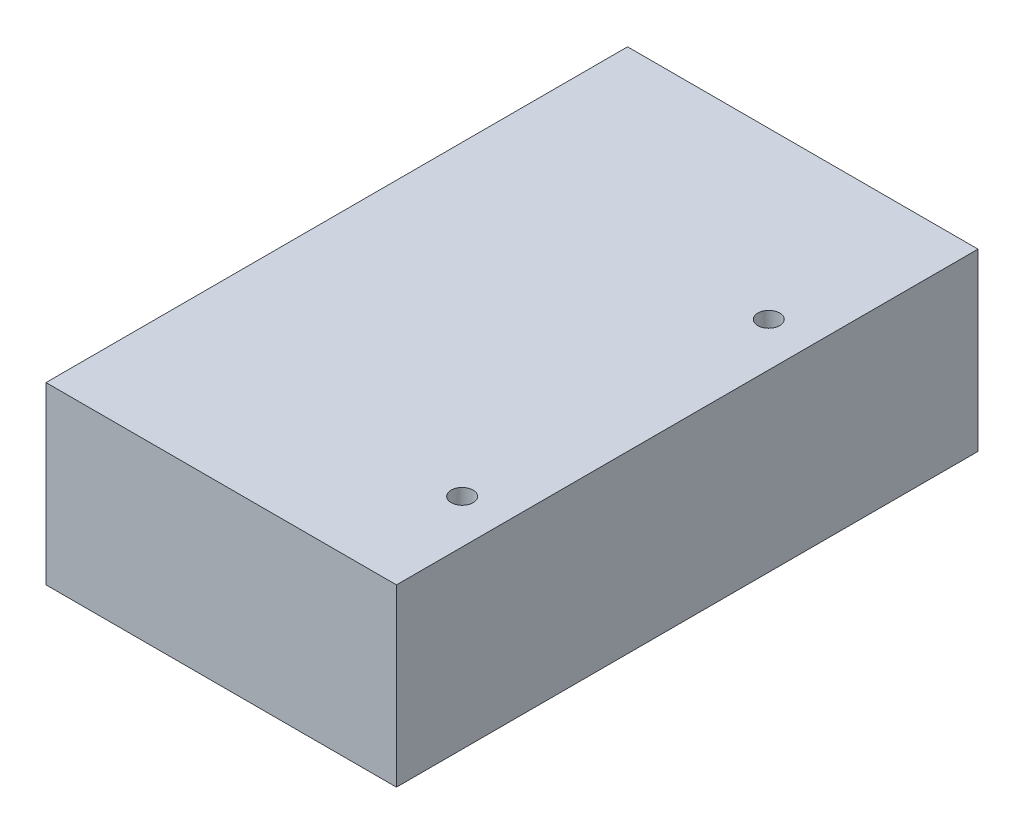
ISO-10303-21;
HEADER;
FILE_DESCRIPTION(('STEP AP214'),'2;1');
FILE_NAME('part.step','',(''),(''),'','','');
FILE_SCHEMA(('AUTOMOTIVE_DESIGN { 1 0 10303 214 1 1 1 1 }'));
ENDSEC;
DATA;
#1=APPLICATION_CONTEXT('core data for automotive mechanical design processes');
#2=APPLICATION_PROTOCOL_DEFINITION('international standard','automotive_design',2000,#1);
#3=PRODUCT_CONTEXT('',#1,'mechanical');
#4=PRODUCT('Part','Part','',(#3));
#5=PRODUCT_RELATED_PRODUCT_CATEGORY('part','',(#4));
#6=PRODUCT_DEFINITION_FORMATION('','',#4);
#7=PRODUCT_DEFINITION_CONTEXT('part definition',#1,'design');
#8=PRODUCT_DEFINITION('design','',#6,#7);
#9=PRODUCT_DEFINITION_SHAPE('','',#8);
#10=(LENGTH_UNIT() NAMED_UNIT(*) SI_UNIT(.MILLI.,.METRE.));
#11=(NAMED_UNIT(*) PLANE_ANGLE_UNIT() SI_UNIT($,.RADIAN.));
#12=(NAMED_UNIT(*) SI_UNIT($,.STERADIAN.) SOLID_ANGLE_UNIT());
#13=UNCERTAINTY_MEASURE_WITH_UNIT(LENGTH_MEASURE(1.E-05),#10,'distance_accuracy_value','');
#14=(GEOMETRIC_REPRESENTATION_CONTEXT(3) GLOBAL_UNCERTAINTY_ASSIGNED_CONTEXT((#13)) GLOBAL_UNIT_ASSIGNED_CONTEXT((#10,
#11,#12)) REPRESENTATION_CONTEXT('',''));
#15=CARTESIAN_POINT('',(0.,0.,0.));
#16=DIRECTION('',(0.,0.,1.));
#17=DIRECTION('',(1.,0.,0.));
#18=AXIS2_PLACEMENT_3D('',#15,#16,#17);
#19=CARTESIAN_POINT('',(0.,25.4,0.));
#20=DIRECTION('',(1.,0.,0.));
#21=DIRECTION('',(0.,0.,-1.));
#22=AXIS2_PLACEMENT_3D('',#19,#20,#21);
#23=PLANE('',#22);
#24=DIRECTION('',(0.,0.,1.));
#25=VECTOR('',#24,1.);
#26=CARTESIAN_POINT('',(0.,0.,0.));
#27=LINE('',#26,#25);
#28=CARTESIAN_POINT('',(0.,0.,-84.3026));
#29=VERTEX_POINT('',#28);
#30=CARTESIAN_POINT('',(0.,0.,0.));
#31=VERTEX_POINT('',#30);
#32=EDGE_CURVE('E76',#29,#31,#27,.T.);
#33=ORIENTED_EDGE('',*,*,#32,.T.);
#34=DIRECTION('',(0.,-1.,0.));
#35=VECTOR('',#34,1.);
#36=CARTESIAN_POINT('',(0.,25.4,0.));
#37=LINE('',#36,#35);
#38=CARTESIAN_POINT('',(0.,25.4,0.));
#39=VERTEX_POINT('',#38);
#40=EDGE_CURVE('E11',#39,#31,#37,.T.);
#41=ORIENTED_EDGE('',*,*,#40,.F.);
#42=DIRECTION('',(0.,0.,1.));
#43=VECTOR('',#42,1.);
#44=CARTESIAN_POINT('',(0.,25.4,0.));
#45=LINE('',#44,#43);
#46=CARTESIAN_POINT('',(0.,25.4,-84.3026));
#47=VERTEX_POINT('',#46);
#48=EDGE_CURVE('E66',#47,#39,#45,.T.);
#49=ORIENTED_EDGE('',*,*,#48,.F.);
#50=DIRECTION('',(0.,-1.,0.));
#51=VECTOR('',#50,1.);
#52=CARTESIAN_POINT('',(0.,25.4,-84.3026));
#53=LINE('',#52,#51);
#54=EDGE_CURVE('E86',#47,#29,#53,.T.);
#55=ORIENTED_EDGE('',*,*,#54,.T.);
#56=EDGE_LOOP('',(#33,#41,#49,#55));
#57=FACE_BOUND('',#56,.T.);
#58=ADVANCED_FACE('F33',(#57),#23,.F.);
#59=CARTESIAN_POINT('',(0.,25.4,0.));
#60=DIRECTION('',(0.,0.,-1.));
#61=DIRECTION('',(-1.,0.,0.));
#62=AXIS2_PLACEMENT_3D('',#59,#60,#61);
#63=PLANE('',#62);
#64=DIRECTION('',(1.,0.,0.));
#65=VECTOR('',#64,1.);
#66=CARTESIAN_POINT('',(0.,0.,0.));
#67=LINE('',#66,#65);
#68=CARTESIAN_POINT('',(50.8,0.,0.));
#69=VERTEX_POINT('',#68);
#70=EDGE_CURVE('E60',#31,#69,#67,.T.);
#71=ORIENTED_EDGE('',*,*,#70,.T.);
#72=DIRECTION('',(0.,-1.,0.));
#73=VECTOR('',#72,1.);
#74=CARTESIAN_POINT('',(50.8,25.4,0.));
#75=LINE('',#74,#73);
#76=CARTESIAN_POINT('',(50.8,25.4,0.));
#77=VERTEX_POINT('',#76);
#78=EDGE_CURVE('E41',#77,#69,#75,.T.);
#79=ORIENTED_EDGE('',*,*,#78,.F.);
#80=DIRECTION('',(1.,0.,0.));
#81=VECTOR('',#80,1.);
#82=CARTESIAN_POINT('',(0.,25.4,0.));
#83=LINE('',#82,#81);
#84=EDGE_CURVE('E49',#39,#77,#83,.T.);
#85=ORIENTED_EDGE('',*,*,#84,.F.);
#86=ORIENTED_EDGE('',*,*,#40,.T.);
#87=EDGE_LOOP('',(#71,#79,#85,#86));
#88=FACE_BOUND('',#87,.T.);
#89=ADVANCED_FACE('F118',(#88),#63,.F.);
#90=CARTESIAN_POINT('',(50.8,25.4,0.));
#91=DIRECTION('',(-1.,0.,0.));
#92=DIRECTION('',(0.,0.,1.));
#93=AXIS2_PLACEMENT_3D('',#90,#91,#92);
#94=PLANE('',#93);
#95=DIRECTION('',(0.,0.,-1.));
#96=VECTOR('',#95,1.);
#97=CARTESIAN_POINT('',(50.8,0.,0.));
#98=LINE('',#97,#96);
#99=CARTESIAN_POINT('',(50.8,0.,-84.3026));
#100=VERTEX_POINT('',#99);
#101=EDGE_CURVE('E108',#69,#100,#98,.T.);
#102=ORIENTED_EDGE('',*,*,#101,.T.);
#103=DIRECTION('',(0.,1.,0.));
#104=VECTOR('',#103,1.);
#105=CARTESIAN_POINT('',(50.8,25.4,-84.3026));
#106=LINE('',#105,#104);
#107=CARTESIAN_POINT('',(50.8,25.4,-84.3026));
#108=VERTEX_POINT('',#107);
#109=EDGE_CURVE('E89',#100,#108,#106,.T.);
#110=ORIENTED_EDGE('',*,*,#109,.T.);
#111=DIRECTION('',(0.,0.,-1.));
#112=VECTOR('',#111,1.);
#113=CARTESIAN_POINT('',(50.8,25.4,0.));
#114=LINE('',#113,#112);
#115=EDGE_CURVE('E110',#77,#108,#114,.T.);
#116=ORIENTED_EDGE('',*,*,#115,.F.);
#117=ORIENTED_EDGE('',*,*,#78,.T.);
#118=EDGE_LOOP('',(#102,#110,#116,#117));
#119=FACE_BOUND('',#118,.T.);
#120=ADVANCED_FACE('F116',(#119),#94,.F.);
#121=CARTESIAN_POINT('',(0.,25.4,0.));
#122=DIRECTION('',(0.,-1.,0.));
#123=DIRECTION('',(0.,0.,-1.));
#124=AXIS2_PLACEMENT_3D('',#121,#122,#123);
#125=PLANE('',#124);
#126=CARTESIAN_POINT('',(44.45,25.4,-60.325));
#127=DIRECTION('',(0.,1.,0.));
#128=DIRECTION('',(0.,0.,1.));
#129=AXIS2_PLACEMENT_3D('',#126,#127,#128);
#130=CIRCLE('',#129,1.5875);
#131=CARTESIAN_POINT('',(44.45,25.4,-58.7375));
#132=VERTEX_POINT('',#131);
#133=EDGE_CURVE('E99',#132,#132,#130,.T.);
#134=ORIENTED_EDGE('',*,*,#133,.F.);
#135=EDGE_LOOP('',(#134));
#136=FACE_BOUND('',#135,.T.);
#137=CARTESIAN_POINT('',(44.45,25.4,-15.875));
#138=DIRECTION('',(0.,1.,0.));
#139=DIRECTION('',(0.,0.,1.));
#140=AXIS2_PLACEMENT_3D('',#137,#138,#139);
#141=CIRCLE('',#140,1.5875);
#142=CARTESIAN_POINT('',(44.45,25.4,-14.2875));
#143=VERTEX_POINT('',#142);
#144=EDGE_CURVE('E96',#143,#143,#141,.T.);
#145=ORIENTED_EDGE('',*,*,#144,.F.);
#146=EDGE_LOOP('',(#145));
#147=FACE_BOUND('',#146,.T.);
#148=ORIENTED_EDGE('',*,*,#48,.T.);
#149=ORIENTED_EDGE('',*,*,#84,.T.);
#150=ORIENTED_EDGE('',*,*,#115,.T.);
#151=DIRECTION('',(-1.,0.,0.));
#152=VECTOR('',#151,1.);
#153=CARTESIAN_POINT('',(0.,25.4,-84.3026));
#154=LINE('',#153,#152);
#155=EDGE_CURVE('E94',#108,#47,#154,.T.);
#156=ORIENTED_EDGE('',*,*,#155,.T.);
#157=EDGE_LOOP('',(#148,#149,#150,#156));
#158=FACE_BOUND('',#157,.T.);
#159=ADVANCED_FACE('F119',(#136,#147,#158),#125,.F.);
#160=CARTESIAN_POINT('',(0.,0.,0.));
#161=DIRECTION('',(0.,-1.,0.));
#162=DIRECTION('',(0.,0.,-1.));
#163=AXIS2_PLACEMENT_3D('',#160,#161,#162);
#164=PLANE('',#163);
#165=CARTESIAN_POINT('',(44.45,0.,-60.325));
#166=DIRECTION('',(0.,1.,0.));
#167=DIRECTION('',(0.,0.,1.));
#168=AXIS2_PLACEMENT_3D('',#165,#166,#167);
#169=CIRCLE('',#168,1.5875);
#170=CARTESIAN_POINT('',(44.45,0.,-58.7375));
#171=VERTEX_POINT('',#170);
#172=EDGE_CURVE('E80',#171,#171,#169,.T.);
#173=ORIENTED_EDGE('',*,*,#172,.T.);
#174=EDGE_LOOP('',(#173));
#175=FACE_BOUND('',#174,.T.);
#176=CARTESIAN_POINT('',(44.45,0.,-15.875));
#177=DIRECTION('',(0.,1.,0.));
#178=DIRECTION('',(0.,0.,1.));
#179=AXIS2_PLACEMENT_3D('',#176,#177,#178);
#180=CIRCLE('',#179,1.5875);
#181=CARTESIAN_POINT('',(44.45,0.,-14.2875));
#182=VERTEX_POINT('',#181);
#183=EDGE_CURVE('E102',#182,#182,#180,.T.);
#184=ORIENTED_EDGE('',*,*,#183,.T.);
#185=EDGE_LOOP('',(#184));
#186=FACE_BOUND('',#185,.T.);
#187=ORIENTED_EDGE('',*,*,#32,.F.);
#188=DIRECTION('',(1.,0.,0.));
#189=VECTOR('',#188,1.);
#190=CARTESIAN_POINT('',(0.,0.,-84.3026));
#191=LINE('',#190,#189);
#192=EDGE_CURVE('E79',#29,#100,#191,.T.);
#193=ORIENTED_EDGE('',*,*,#192,.T.);
#194=ORIENTED_EDGE('',*,*,#101,.F.);
#195=ORIENTED_EDGE('',*,*,#70,.F.);
#196=EDGE_LOOP('',(#187,#193,#194,#195));
#197=FACE_BOUND('',#196,.T.);
#198=ADVANCED_FACE('F78',(#175,#186,#197),#164,.T.);
#199=CARTESIAN_POINT('',(44.45,0.,-15.875));
#200=DIRECTION('',(0.,1.,0.));
#201=DIRECTION('',(0.,0.,1.));
#202=AXIS2_PLACEMENT_3D('',#199,#200,#201);
#203=CYLINDRICAL_SURFACE('',#202,1.5875);
#204=ORIENTED_EDGE('',*,*,#183,.F.);
#205=EDGE_LOOP('',(#204));
#206=FACE_BOUND('',#205,.T.);
#207=ORIENTED_EDGE('',*,*,#144,.T.);
#208=EDGE_LOOP('',(#207));
#209=FACE_BOUND('',#208,.T.);
#210=ADVANCED_FACE('F127',(#206,#209),#203,.F.);
#211=CARTESIAN_POINT('',(44.45,0.,-60.325));
#212=DIRECTION('',(0.,1.,0.));
#213=DIRECTION('',(0.,0.,1.));
#214=AXIS2_PLACEMENT_3D('',#211,#212,#213);
#215=CYLINDRICAL_SURFACE('',#214,1.5875);
#216=ORIENTED_EDGE('',*,*,#172,.F.);
#217=EDGE_LOOP('',(#216));
#218=FACE_BOUND('',#217,.T.);
#219=ORIENTED_EDGE('',*,*,#133,.T.);
#220=EDGE_LOOP('',(#219));
#221=FACE_BOUND('',#220,.T.);
#222=ADVANCED_FACE('F146',(#218,#221),#215,.F.);
#223=CARTESIAN_POINT('',(0.,0.,-84.3026));
#224=DIRECTION('',(0.,0.,1.));
#225=DIRECTION('',(1.,0.,0.));
#226=AXIS2_PLACEMENT_3D('',#223,#224,#225);
#227=PLANE('',#226);
#228=ORIENTED_EDGE('',*,*,#54,.F.);
#229=ORIENTED_EDGE('',*,*,#155,.F.);
#230=ORIENTED_EDGE('',*,*,#109,.F.);
#231=ORIENTED_EDGE('',*,*,#192,.F.);
#232=EDGE_LOOP('',(#228,#229,#230,#231));
#233=FACE_BOUND('',#232,.T.);
#234=ADVANCED_FACE('F84',(#233),#227,.F.);
#235=CLOSED_SHELL('',(#58,#89,#120,#159,#198,#210,#222,#234));
#236=MANIFOLD_SOLID_BREP('B2',#235);
#237=ADVANCED_BREP_SHAPE_REPRESENTATION('',(#18,#236),#14);
#238=SHAPE_DEFINITION_REPRESENTATION(#9,#237);
ENDSEC;
END-ISO-10303-21;
